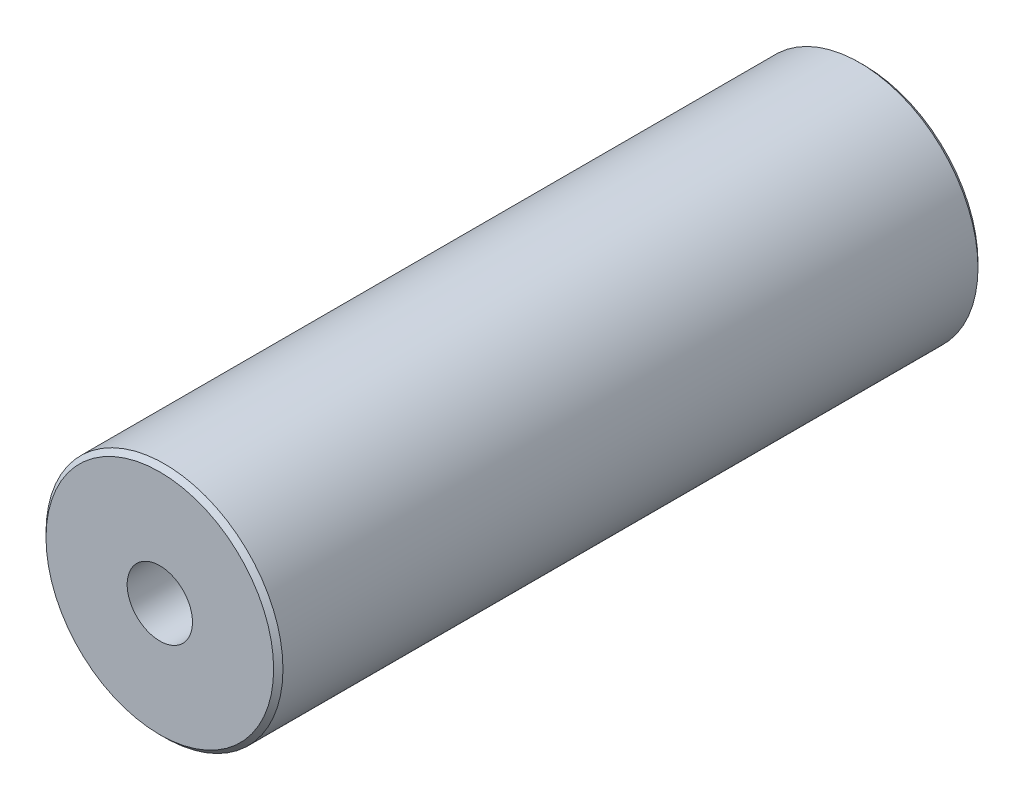
ISO-10303-21;
HEADER;
FILE_DESCRIPTION(('STEP AP214'),'2;1');
FILE_NAME('part.step','',(''),(''),'','','');
FILE_SCHEMA(('AUTOMOTIVE_DESIGN { 1 0 10303 214 1 1 1 1 }'));
ENDSEC;
DATA;
#1=APPLICATION_CONTEXT('core data for automotive mechanical design processes');
#2=APPLICATION_PROTOCOL_DEFINITION('international standard','automotive_design',2000,#1);
#3=PRODUCT_CONTEXT('',#1,'mechanical');
#4=PRODUCT('Part','Part','',(#3));
#5=PRODUCT_RELATED_PRODUCT_CATEGORY('part','',(#4));
#6=PRODUCT_DEFINITION_FORMATION('','',#4);
#7=PRODUCT_DEFINITION_CONTEXT('part definition',#1,'design');
#8=PRODUCT_DEFINITION('design','',#6,#7);
#9=PRODUCT_DEFINITION_SHAPE('','',#8);
#10=(LENGTH_UNIT() NAMED_UNIT(*) SI_UNIT(.MILLI.,.METRE.));
#11=(NAMED_UNIT(*) PLANE_ANGLE_UNIT() SI_UNIT($,.RADIAN.));
#12=(NAMED_UNIT(*) SI_UNIT($,.STERADIAN.) SOLID_ANGLE_UNIT());
#13=UNCERTAINTY_MEASURE_WITH_UNIT(LENGTH_MEASURE(1.E-05),#10,'distance_accuracy_value','');
#14=(GEOMETRIC_REPRESENTATION_CONTEXT(3) GLOBAL_UNCERTAINTY_ASSIGNED_CONTEXT((#13)) GLOBAL_UNIT_ASSIGNED_CONTEXT((#10,
#11,#12)) REPRESENTATION_CONTEXT('',''));
#15=CARTESIAN_POINT('',(0.,0.,0.));
#16=DIRECTION('',(0.,0.,1.));
#17=DIRECTION('',(1.,0.,0.));
#18=AXIS2_PLACEMENT_3D('',#15,#16,#17);
#19=CARTESIAN_POINT('',(0.,0.,37.75));
#20=DIRECTION('',(0.,0.,-1.));
#21=DIRECTION('',(-1.,0.,0.));
#22=AXIS2_PLACEMENT_3D('',#19,#20,#21);
#23=CYLINDRICAL_SURFACE('',#22,12.7);
#24=CARTESIAN_POINT('',(0.,0.,-37.25));
#25=DIRECTION('',(0.,0.,1.));
#26=DIRECTION('',(1.,0.,0.));
#27=AXIS2_PLACEMENT_3D('',#24,#25,#26);
#28=CIRCLE('',#27,12.7);
#29=CARTESIAN_POINT('',(12.7,0.,-37.25));
#30=VERTEX_POINT('',#29);
#31=EDGE_CURVE('E74',#30,#30,#28,.T.);
#32=ORIENTED_EDGE('',*,*,#31,.T.);
#33=EDGE_LOOP('',(#32));
#34=FACE_BOUND('',#33,.T.);
#35=CARTESIAN_POINT('',(0.,0.,37.25));
#36=DIRECTION('',(0.,0.,1.));
#37=DIRECTION('',(1.,0.,0.));
#38=AXIS2_PLACEMENT_3D('',#35,#36,#37);
#39=CIRCLE('',#38,12.7);
#40=CARTESIAN_POINT('',(12.7,0.,37.25));
#41=VERTEX_POINT('',#40);
#42=EDGE_CURVE('E71',#41,#41,#39,.F.);
#43=ORIENTED_EDGE('',*,*,#42,.T.);
#44=EDGE_LOOP('',(#43));
#45=FACE_BOUND('',#44,.T.);
#46=ADVANCED_FACE('F36',(#34,#45),#23,.T.);
#47=CARTESIAN_POINT('',(0.,0.,37.75));
#48=DIRECTION('',(0.,0.,1.));
#49=DIRECTION('',(1.,0.,0.));
#50=AXIS2_PLACEMENT_3D('',#47,#48,#49);
#51=PLANE('',#50);
#52=CARTESIAN_POINT('',(0.,0.,37.75));
#53=DIRECTION('',(0.,0.,1.));
#54=DIRECTION('',(1.,0.,0.));
#55=AXIS2_PLACEMENT_3D('',#52,#53,#54);
#56=CIRCLE('',#55,12.2);
#57=CARTESIAN_POINT('',(12.2,0.,37.75));
#58=VERTEX_POINT('',#57);
#59=EDGE_CURVE('E11',#58,#58,#56,.T.);
#60=ORIENTED_EDGE('',*,*,#59,.T.);
#61=EDGE_LOOP('',(#60));
#62=FACE_BOUND('',#61,.T.);
#63=CARTESIAN_POINT('',(0.,0.,37.75));
#64=DIRECTION('',(0.,0.,1.));
#65=DIRECTION('',(1.,0.,0.));
#66=AXIS2_PLACEMENT_3D('',#63,#64,#65);
#67=CIRCLE('',#66,3.5);
#68=CARTESIAN_POINT('',(3.5,0.,37.75));
#69=VERTEX_POINT('',#68);
#70=EDGE_CURVE('E60',#69,#69,#67,.T.);
#71=ORIENTED_EDGE('',*,*,#70,.F.);
#72=EDGE_LOOP('',(#71));
#73=FACE_BOUND('',#72,.T.);
#74=ADVANCED_FACE('F89',(#62,#73),#51,.T.);
#75=CARTESIAN_POINT('',(0.,0.,-37.75));
#76=DIRECTION('',(0.,0.,1.));
#77=DIRECTION('',(1.,0.,0.));
#78=AXIS2_PLACEMENT_3D('',#75,#76,#77);
#79=PLANE('',#78);
#80=CARTESIAN_POINT('',(0.,0.,-37.75));
#81=DIRECTION('',(0.,0.,1.));
#82=DIRECTION('',(1.,0.,0.));
#83=AXIS2_PLACEMENT_3D('',#80,#81,#82);
#84=CIRCLE('',#83,12.2);
#85=CARTESIAN_POINT('',(12.2,0.,-37.75));
#86=VERTEX_POINT('',#85);
#87=EDGE_CURVE('E44',#86,#86,#84,.F.);
#88=ORIENTED_EDGE('',*,*,#87,.T.);
#89=EDGE_LOOP('',(#88));
#90=FACE_BOUND('',#89,.T.);
#91=CARTESIAN_POINT('',(0.,0.,-37.75));
#92=DIRECTION('',(0.,0.,-1.));
#93=DIRECTION('',(-1.,0.,0.));
#94=AXIS2_PLACEMENT_3D('',#91,#92,#93);
#95=CIRCLE('',#94,3.5);
#96=CARTESIAN_POINT('',(-3.5,0.,-37.75));
#97=VERTEX_POINT('',#96);
#98=EDGE_CURVE('E61',#97,#97,#95,.T.);
#99=ORIENTED_EDGE('',*,*,#98,.F.);
#100=EDGE_LOOP('',(#99));
#101=FACE_BOUND('',#100,.T.);
#102=ADVANCED_FACE('F79',(#90,#101),#79,.F.);
#103=CARTESIAN_POINT('',(0.,0.,25.75));
#104=DIRECTION('',(0.,0.,1.));
#105=DIRECTION('',(1.,0.,0.));
#106=AXIS2_PLACEMENT_3D('',#103,#104,#105);
#107=CONICAL_SURFACE('',#106,3.5,1.02974425867665);
#108=CARTESIAN_POINT('',(0.,0.,23.6469878334035));
#109=VERTEX_POINT('',#108);
#110=VERTEX_LOOP('',#109);
#111=FACE_BOUND('',#110,.T.);
#112=CARTESIAN_POINT('',(0.,0.,25.75));
#113=DIRECTION('',(0.,0.,1.));
#114=DIRECTION('',(1.,0.,0.));
#115=AXIS2_PLACEMENT_3D('',#112,#113,#114);
#116=CIRCLE('',#115,3.5);
#117=CARTESIAN_POINT('',(3.5,0.,25.75));
#118=VERTEX_POINT('',#117);
#119=EDGE_CURVE('E64',#118,#118,#116,.T.);
#120=ORIENTED_EDGE('',*,*,#119,.T.);
#121=EDGE_LOOP('',(#120));
#122=FACE_BOUND('',#121,.T.);
#123=ADVANCED_FACE('F103',(#111,#122),#107,.F.);
#124=CARTESIAN_POINT('',(0.,0.,37.75));
#125=DIRECTION('',(0.,0.,1.));
#126=DIRECTION('',(1.,0.,0.));
#127=AXIS2_PLACEMENT_3D('',#124,#125,#126);
#128=CYLINDRICAL_SURFACE('',#127,3.5);
#129=ORIENTED_EDGE('',*,*,#119,.F.);
#130=EDGE_LOOP('',(#129));
#131=FACE_BOUND('',#130,.T.);
#132=ORIENTED_EDGE('',*,*,#70,.T.);
#133=EDGE_LOOP('',(#132));
#134=FACE_BOUND('',#133,.T.);
#135=ADVANCED_FACE('F54',(#131,#134),#128,.F.);
#136=CARTESIAN_POINT('',(0.,0.,-25.75));
#137=DIRECTION('',(0.,0.,-1.));
#138=DIRECTION('',(-1.,0.,0.));
#139=AXIS2_PLACEMENT_3D('',#136,#137,#138);
#140=CONICAL_SURFACE('',#139,3.5,1.02974425867665);
#141=CARTESIAN_POINT('',(0.,0.,-23.6469878334035));
#142=VERTEX_POINT('',#141);
#143=VERTEX_LOOP('',#142);
#144=FACE_BOUND('',#143,.T.);
#145=CARTESIAN_POINT('',(0.,0.,-25.75));
#146=DIRECTION('',(0.,0.,-1.));
#147=DIRECTION('',(-1.,0.,0.));
#148=AXIS2_PLACEMENT_3D('',#145,#146,#147);
#149=CIRCLE('',#148,3.5);
#150=CARTESIAN_POINT('',(-3.5,0.,-25.75));
#151=VERTEX_POINT('',#150);
#152=EDGE_CURVE('E58',#151,#151,#149,.T.);
#153=ORIENTED_EDGE('',*,*,#152,.T.);
#154=EDGE_LOOP('',(#153));
#155=FACE_BOUND('',#154,.T.);
#156=ADVANCED_FACE('F50',(#144,#155),#140,.F.);
#157=CARTESIAN_POINT('',(0.,0.,-37.75));
#158=DIRECTION('',(0.,0.,-1.));
#159=DIRECTION('',(-1.,0.,0.));
#160=AXIS2_PLACEMENT_3D('',#157,#158,#159);
#161=CYLINDRICAL_SURFACE('',#160,3.5);
#162=ORIENTED_EDGE('',*,*,#152,.F.);
#163=EDGE_LOOP('',(#162));
#164=FACE_BOUND('',#163,.T.);
#165=ORIENTED_EDGE('',*,*,#98,.T.);
#166=EDGE_LOOP('',(#165));
#167=FACE_BOUND('',#166,.T.);
#168=ADVANCED_FACE('F53',(#164,#167),#161,.F.);
#169=CARTESIAN_POINT('',(0.,0.,-37.25));
#170=DIRECTION('',(0.,0.,1.));
#171=DIRECTION('',(1.,0.,0.));
#172=AXIS2_PLACEMENT_3D('',#169,#170,#171);
#173=CONICAL_SURFACE('',#172,12.7,0.785398163397452);
#174=ORIENTED_EDGE('',*,*,#87,.F.);
#175=EDGE_LOOP('',(#174));
#176=FACE_BOUND('',#175,.T.);
#177=ORIENTED_EDGE('',*,*,#31,.F.);
#178=EDGE_LOOP('',(#177));
#179=FACE_BOUND('',#178,.T.);
#180=ADVANCED_FACE('F82',(#176,#179),#173,.T.);
#181=CARTESIAN_POINT('',(0.,0.,37.75));
#182=DIRECTION('',(0.,0.,-1.));
#183=DIRECTION('',(-1.,0.,0.));
#184=AXIS2_PLACEMENT_3D('',#181,#182,#183);
#185=CONICAL_SURFACE('',#184,12.2,0.785398163397445);
#186=ORIENTED_EDGE('',*,*,#42,.F.);
#187=EDGE_LOOP('',(#186));
#188=FACE_BOUND('',#187,.T.);
#189=ORIENTED_EDGE('',*,*,#59,.F.);
#190=EDGE_LOOP('',(#189));
#191=FACE_BOUND('',#190,.T.);
#192=ADVANCED_FACE('F38',(#188,#191),#185,.T.);
#193=CLOSED_SHELL('',(#46,#74,#102,#123,#135,#156,#168,#180,#192));
#194=MANIFOLD_SOLID_BREP('B2',#193);
#195=ADVANCED_BREP_SHAPE_REPRESENTATION('',(#18,#194),#14);
#196=SHAPE_DEFINITION_REPRESENTATION(#9,#195);
ENDSEC;
END-ISO-10303-21;
